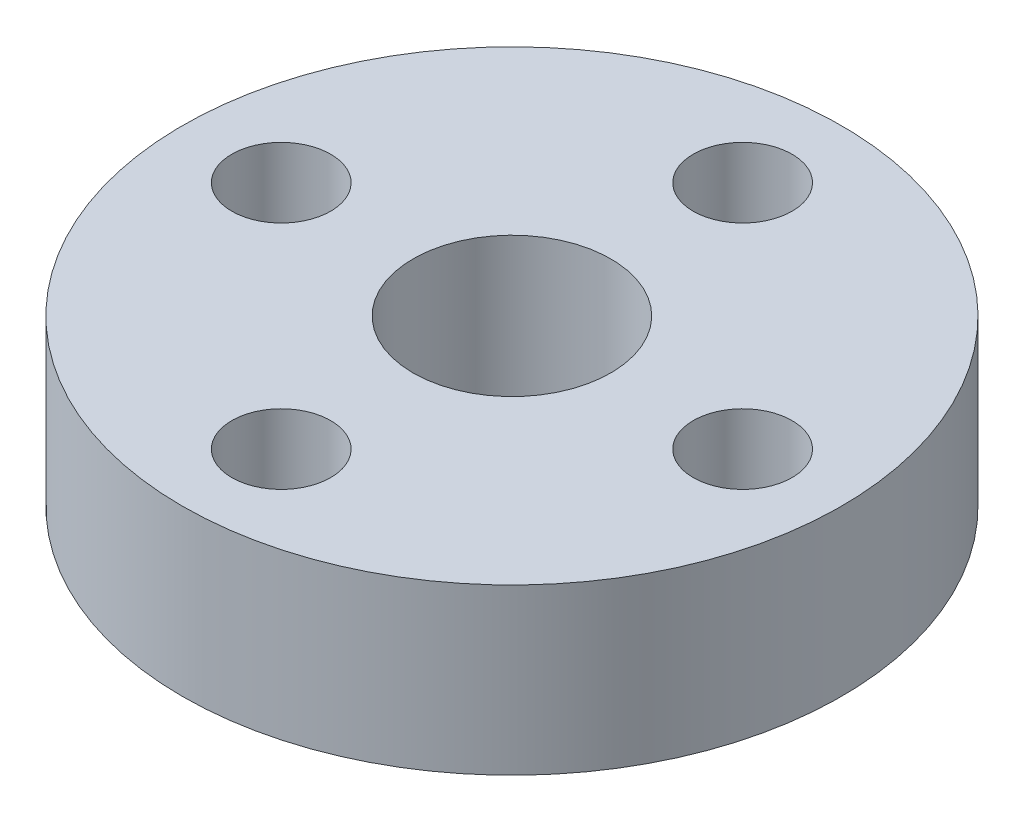
ISO-10303-21;
HEADER;
FILE_DESCRIPTION(('STEP AP214'),'2;1');
FILE_NAME('part.step','',(''),(''),'','','');
FILE_SCHEMA(('AUTOMOTIVE_DESIGN { 1 0 10303 214 1 1 1 1 }'));
ENDSEC;
DATA;
#1=APPLICATION_CONTEXT('core data for automotive mechanical design processes');
#2=APPLICATION_PROTOCOL_DEFINITION('international standard','automotive_design',2000,#1);
#3=PRODUCT_CONTEXT('',#1,'mechanical');
#4=PRODUCT('Part','Part','',(#3));
#5=PRODUCT_RELATED_PRODUCT_CATEGORY('part','',(#4));
#6=PRODUCT_DEFINITION_FORMATION('','',#4);
#7=PRODUCT_DEFINITION_CONTEXT('part definition',#1,'design');
#8=PRODUCT_DEFINITION('design','',#6,#7);
#9=PRODUCT_DEFINITION_SHAPE('','',#8);
#10=(LENGTH_UNIT() NAMED_UNIT(*) SI_UNIT(.MILLI.,.METRE.));
#11=(NAMED_UNIT(*) PLANE_ANGLE_UNIT() SI_UNIT($,.RADIAN.));
#12=(NAMED_UNIT(*) SI_UNIT($,.STERADIAN.) SOLID_ANGLE_UNIT());
#13=UNCERTAINTY_MEASURE_WITH_UNIT(LENGTH_MEASURE(1.E-05),#10,'distance_accuracy_value','');
#14=(GEOMETRIC_REPRESENTATION_CONTEXT(3) GLOBAL_UNCERTAINTY_ASSIGNED_CONTEXT((#13)) GLOBAL_UNIT_ASSIGNED_CONTEXT((#10,
#11,#12)) REPRESENTATION_CONTEXT('',''));
#15=CARTESIAN_POINT('',(0.,0.,0.));
#16=DIRECTION('',(0.,0.,1.));
#17=DIRECTION('',(1.,0.,0.));
#18=AXIS2_PLACEMENT_3D('',#15,#16,#17);
#19=CARTESIAN_POINT('',(0.,5.,0.));
#20=DIRECTION('',(0.,1.,0.));
#21=DIRECTION('',(0.,0.,1.));
#22=AXIS2_PLACEMENT_3D('',#19,#20,#21);
#23=PLANE('',#22);
#24=CARTESIAN_POINT('',(7.,5.,0.));
#25=DIRECTION('',(0.,1.,0.));
#26=DIRECTION('',(0.,0.,1.));
#27=AXIS2_PLACEMENT_3D('',#24,#25,#26);
#28=CIRCLE('',#27,1.5);
#29=CARTESIAN_POINT('',(7.,5.,1.50000000000005));
#30=VERTEX_POINT('',#29);
#31=EDGE_CURVE('E61',#30,#30,#28,.T.);
#32=ORIENTED_EDGE('',*,*,#31,.F.);
#33=EDGE_LOOP('',(#32));
#34=FACE_BOUND('',#33,.T.);
#35=CARTESIAN_POINT('',(0.,5.,0.));
#36=DIRECTION('',(0.,1.,0.));
#37=DIRECTION('',(0.,0.,1.));
#38=AXIS2_PLACEMENT_3D('',#35,#36,#37);
#39=CIRCLE('',#38,3.);
#40=CARTESIAN_POINT('',(0.,5.,3.));
#41=VERTEX_POINT('',#40);
#42=EDGE_CURVE('E49',#41,#41,#39,.T.);
#43=ORIENTED_EDGE('',*,*,#42,.F.);
#44=EDGE_LOOP('',(#43));
#45=FACE_BOUND('',#44,.T.);
#46=CARTESIAN_POINT('',(0.,5.,0.));
#47=DIRECTION('',(0.,1.,0.));
#48=DIRECTION('',(0.,0.,1.));
#49=AXIS2_PLACEMENT_3D('',#46,#47,#48);
#50=CIRCLE('',#49,10.);
#51=CARTESIAN_POINT('',(0.,5.,10.));
#52=VERTEX_POINT('',#51);
#53=EDGE_CURVE('E10',#52,#52,#50,.T.);
#54=ORIENTED_EDGE('',*,*,#53,.T.);
#55=EDGE_LOOP('',(#54));
#56=FACE_BOUND('',#55,.T.);
#57=CARTESIAN_POINT('',(-7.,5.,0.));
#58=DIRECTION('',(0.,1.,0.));
#59=DIRECTION('',(0.,0.,1.));
#60=AXIS2_PLACEMENT_3D('',#57,#58,#59);
#61=CIRCLE('',#60,1.5);
#62=CARTESIAN_POINT('',(-7.,5.,1.5));
#63=VERTEX_POINT('',#62);
#64=EDGE_CURVE('E44',#63,#63,#61,.T.);
#65=ORIENTED_EDGE('',*,*,#64,.F.);
#66=EDGE_LOOP('',(#65));
#67=FACE_BOUND('',#66,.T.);
#68=CARTESIAN_POINT('',(0.,5.,-7.));
#69=DIRECTION('',(0.,1.,0.));
#70=DIRECTION('',(0.,0.,1.));
#71=AXIS2_PLACEMENT_3D('',#68,#69,#70);
#72=CIRCLE('',#71,1.5);
#73=CARTESIAN_POINT('',(0.,5.,-5.5));
#74=VERTEX_POINT('',#73);
#75=EDGE_CURVE('E55',#74,#74,#72,.T.);
#76=ORIENTED_EDGE('',*,*,#75,.F.);
#77=EDGE_LOOP('',(#76));
#78=FACE_BOUND('',#77,.T.);
#79=CARTESIAN_POINT('',(0.,5.,7.));
#80=DIRECTION('',(0.,1.,0.));
#81=DIRECTION('',(0.,0.,1.));
#82=AXIS2_PLACEMENT_3D('',#79,#80,#81);
#83=CIRCLE('',#82,1.5);
#84=CARTESIAN_POINT('',(0.,5.,8.5));
#85=VERTEX_POINT('',#84);
#86=EDGE_CURVE('E67',#85,#85,#83,.T.);
#87=ORIENTED_EDGE('',*,*,#86,.F.);
#88=EDGE_LOOP('',(#87));
#89=FACE_BOUND('',#88,.T.);
#90=ADVANCED_FACE('F33',(#34,#45,#56,#67,#78,#89),#23,.T.);
#91=CARTESIAN_POINT('',(0.,0.,0.));
#92=DIRECTION('',(0.,1.,0.));
#93=DIRECTION('',(0.,0.,1.));
#94=AXIS2_PLACEMENT_3D('',#91,#92,#93);
#95=PLANE('',#94);
#96=CARTESIAN_POINT('',(0.,0.,0.));
#97=DIRECTION('',(0.,1.,0.));
#98=DIRECTION('',(0.,0.,1.));
#99=AXIS2_PLACEMENT_3D('',#96,#97,#98);
#100=CIRCLE('',#99,10.);
#101=CARTESIAN_POINT('',(0.,0.,10.));
#102=VERTEX_POINT('',#101);
#103=EDGE_CURVE('E37',#102,#102,#100,.T.);
#104=ORIENTED_EDGE('',*,*,#103,.F.);
#105=EDGE_LOOP('',(#104));
#106=FACE_BOUND('',#105,.T.);
#107=CARTESIAN_POINT('',(-7.,0.,0.));
#108=DIRECTION('',(0.,1.,0.));
#109=DIRECTION('',(0.,0.,1.));
#110=AXIS2_PLACEMENT_3D('',#107,#108,#109);
#111=CIRCLE('',#110,1.5);
#112=CARTESIAN_POINT('',(-7.,0.,1.5));
#113=VERTEX_POINT('',#112);
#114=EDGE_CURVE('E46',#113,#113,#111,.T.);
#115=ORIENTED_EDGE('',*,*,#114,.T.);
#116=EDGE_LOOP('',(#115));
#117=FACE_BOUND('',#116,.T.);
#118=CARTESIAN_POINT('',(0.,0.,0.));
#119=DIRECTION('',(0.,1.,0.));
#120=DIRECTION('',(0.,0.,1.));
#121=AXIS2_PLACEMENT_3D('',#118,#119,#120);
#122=CIRCLE('',#121,3.);
#123=CARTESIAN_POINT('',(0.,0.,3.));
#124=VERTEX_POINT('',#123);
#125=EDGE_CURVE('E52',#124,#124,#122,.T.);
#126=ORIENTED_EDGE('',*,*,#125,.T.);
#127=EDGE_LOOP('',(#126));
#128=FACE_BOUND('',#127,.T.);
#129=CARTESIAN_POINT('',(0.,0.,-7.));
#130=DIRECTION('',(0.,1.,0.));
#131=DIRECTION('',(0.,0.,1.));
#132=AXIS2_PLACEMENT_3D('',#129,#130,#131);
#133=CIRCLE('',#132,1.5);
#134=CARTESIAN_POINT('',(0.,0.,-5.5));
#135=VERTEX_POINT('',#134);
#136=EDGE_CURVE('E58',#135,#135,#133,.T.);
#137=ORIENTED_EDGE('',*,*,#136,.T.);
#138=EDGE_LOOP('',(#137));
#139=FACE_BOUND('',#138,.T.);
#140=CARTESIAN_POINT('',(7.,0.,0.));
#141=DIRECTION('',(0.,1.,0.));
#142=DIRECTION('',(0.,0.,1.));
#143=AXIS2_PLACEMENT_3D('',#140,#141,#142);
#144=CIRCLE('',#143,1.5);
#145=CARTESIAN_POINT('',(7.,0.,1.50000000000005));
#146=VERTEX_POINT('',#145);
#147=EDGE_CURVE('E64',#146,#146,#144,.T.);
#148=ORIENTED_EDGE('',*,*,#147,.T.);
#149=EDGE_LOOP('',(#148));
#150=FACE_BOUND('',#149,.T.);
#151=CARTESIAN_POINT('',(0.,0.,7.));
#152=DIRECTION('',(0.,1.,0.));
#153=DIRECTION('',(0.,0.,1.));
#154=AXIS2_PLACEMENT_3D('',#151,#152,#153);
#155=CIRCLE('',#154,1.5);
#156=CARTESIAN_POINT('',(0.,0.,8.5));
#157=VERTEX_POINT('',#156);
#158=EDGE_CURVE('E70',#157,#157,#155,.T.);
#159=ORIENTED_EDGE('',*,*,#158,.T.);
#160=EDGE_LOOP('',(#159));
#161=FACE_BOUND('',#160,.T.);
#162=ADVANCED_FACE('F80',(#106,#117,#128,#139,#150,#161),#95,.F.);
#163=CARTESIAN_POINT('',(0.,5.,0.));
#164=DIRECTION('',(0.,-1.,0.));
#165=DIRECTION('',(0.,0.,-1.));
#166=AXIS2_PLACEMENT_3D('',#163,#164,#165);
#167=CYLINDRICAL_SURFACE('',#166,10.);
#168=ORIENTED_EDGE('',*,*,#53,.F.);
#169=EDGE_LOOP('',(#168));
#170=FACE_BOUND('',#169,.T.);
#171=ORIENTED_EDGE('',*,*,#103,.T.);
#172=EDGE_LOOP('',(#171));
#173=FACE_BOUND('',#172,.T.);
#174=ADVANCED_FACE('F35',(#170,#173),#167,.T.);
#175=CARTESIAN_POINT('',(-7.,5.,0.));
#176=DIRECTION('',(0.,-1.,0.));
#177=DIRECTION('',(0.,0.,-1.));
#178=AXIS2_PLACEMENT_3D('',#175,#176,#177);
#179=CYLINDRICAL_SURFACE('',#178,1.5);
#180=ORIENTED_EDGE('',*,*,#64,.T.);
#181=EDGE_LOOP('',(#180));
#182=FACE_BOUND('',#181,.T.);
#183=ORIENTED_EDGE('',*,*,#114,.F.);
#184=EDGE_LOOP('',(#183));
#185=FACE_BOUND('',#184,.T.);
#186=ADVANCED_FACE('F90',(#182,#185),#179,.F.);
#187=CARTESIAN_POINT('',(0.,5.,0.));
#188=DIRECTION('',(0.,-1.,0.));
#189=DIRECTION('',(0.,0.,-1.));
#190=AXIS2_PLACEMENT_3D('',#187,#188,#189);
#191=CYLINDRICAL_SURFACE('',#190,3.);
#192=ORIENTED_EDGE('',*,*,#42,.T.);
#193=EDGE_LOOP('',(#192));
#194=FACE_BOUND('',#193,.T.);
#195=ORIENTED_EDGE('',*,*,#125,.F.);
#196=EDGE_LOOP('',(#195));
#197=FACE_BOUND('',#196,.T.);
#198=ADVANCED_FACE('F93',(#194,#197),#191,.F.);
#199=CARTESIAN_POINT('',(0.,5.,-7.));
#200=DIRECTION('',(0.,-1.,0.));
#201=DIRECTION('',(0.,0.,-1.));
#202=AXIS2_PLACEMENT_3D('',#199,#200,#201);
#203=CYLINDRICAL_SURFACE('',#202,1.5);
#204=ORIENTED_EDGE('',*,*,#75,.T.);
#205=EDGE_LOOP('',(#204));
#206=FACE_BOUND('',#205,.T.);
#207=ORIENTED_EDGE('',*,*,#136,.F.);
#208=EDGE_LOOP('',(#207));
#209=FACE_BOUND('',#208,.T.);
#210=ADVANCED_FACE('F97',(#206,#209),#203,.F.);
#211=CARTESIAN_POINT('',(7.,5.,0.));
#212=DIRECTION('',(0.,-1.,0.));
#213=DIRECTION('',(0.,0.,-1.));
#214=AXIS2_PLACEMENT_3D('',#211,#212,#213);
#215=CYLINDRICAL_SURFACE('',#214,1.5);
#216=ORIENTED_EDGE('',*,*,#31,.T.);
#217=EDGE_LOOP('',(#216));
#218=FACE_BOUND('',#217,.T.);
#219=ORIENTED_EDGE('',*,*,#147,.F.);
#220=EDGE_LOOP('',(#219));
#221=FACE_BOUND('',#220,.T.);
#222=ADVANCED_FACE('F101',(#218,#221),#215,.F.);
#223=CARTESIAN_POINT('',(0.,5.,7.));
#224=DIRECTION('',(0.,-1.,0.));
#225=DIRECTION('',(0.,0.,-1.));
#226=AXIS2_PLACEMENT_3D('',#223,#224,#225);
#227=CYLINDRICAL_SURFACE('',#226,1.5);
#228=ORIENTED_EDGE('',*,*,#86,.T.);
#229=EDGE_LOOP('',(#228));
#230=FACE_BOUND('',#229,.T.);
#231=ORIENTED_EDGE('',*,*,#158,.F.);
#232=EDGE_LOOP('',(#231));
#233=FACE_BOUND('',#232,.T.);
#234=ADVANCED_FACE('F76',(#230,#233),#227,.F.);
#235=CLOSED_SHELL('',(#90,#162,#174,#186,#198,#210,#222,#234));
#236=MANIFOLD_SOLID_BREP('B2',#235);
#237=ADVANCED_BREP_SHAPE_REPRESENTATION('',(#18,#236),#14);
#238=SHAPE_DEFINITION_REPRESENTATION(#9,#237);
ENDSEC;
END-ISO-10303-21;
